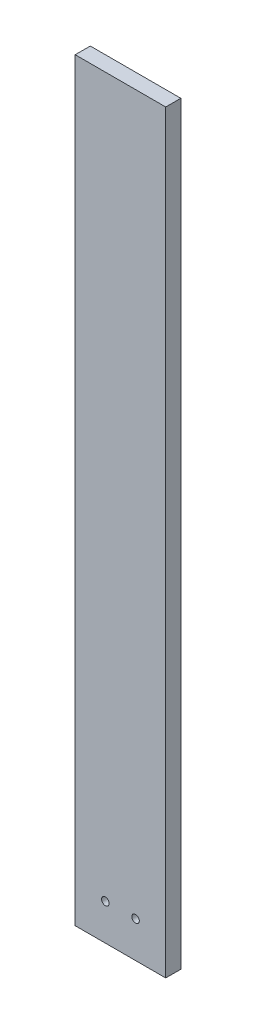
ISO-10303-21;
HEADER;
FILE_DESCRIPTION(('STEP AP214'),'2;1');
FILE_NAME('part.step','',(''),(''),'','','');
FILE_SCHEMA(('AUTOMOTIVE_DESIGN { 1 0 10303 214 1 1 1 1 }'));
ENDSEC;
DATA;
#1=APPLICATION_CONTEXT('core data for automotive mechanical design processes');
#2=APPLICATION_PROTOCOL_DEFINITION('international standard','automotive_design',2000,#1);
#3=PRODUCT_CONTEXT('',#1,'mechanical');
#4=PRODUCT('Part','Part','',(#3));
#5=PRODUCT_RELATED_PRODUCT_CATEGORY('part','',(#4));
#6=PRODUCT_DEFINITION_FORMATION('','',#4);
#7=PRODUCT_DEFINITION_CONTEXT('part definition',#1,'design');
#8=PRODUCT_DEFINITION('design','',#6,#7);
#9=PRODUCT_DEFINITION_SHAPE('','',#8);
#10=(LENGTH_UNIT() NAMED_UNIT(*) SI_UNIT(.MILLI.,.METRE.));
#11=(NAMED_UNIT(*) PLANE_ANGLE_UNIT() SI_UNIT($,.RADIAN.));
#12=(NAMED_UNIT(*) SI_UNIT($,.STERADIAN.) SOLID_ANGLE_UNIT());
#13=UNCERTAINTY_MEASURE_WITH_UNIT(LENGTH_MEASURE(1.E-05),#10,'distance_accuracy_value','');
#14=(GEOMETRIC_REPRESENTATION_CONTEXT(3) GLOBAL_UNCERTAINTY_ASSIGNED_CONTEXT((#13)) GLOBAL_UNIT_ASSIGNED_CONTEXT((#10,
#11,#12)) REPRESENTATION_CONTEXT('',''));
#15=CARTESIAN_POINT('',(0.,0.,0.));
#16=DIRECTION('',(0.,0.,1.));
#17=DIRECTION('',(1.,0.,0.));
#18=AXIS2_PLACEMENT_3D('',#15,#16,#17);
#19=CARTESIAN_POINT('',(30.,-250.,10.));
#20=DIRECTION('',(-1.,0.,0.));
#21=DIRECTION('',(0.,0.,1.));
#22=AXIS2_PLACEMENT_3D('',#19,#20,#21);
#23=PLANE('',#22);
#24=DIRECTION('',(0.,1.,0.));
#25=VECTOR('',#24,1.);
#26=CARTESIAN_POINT('',(30.,-250.,0.));
#27=LINE('',#26,#25);
#28=CARTESIAN_POINT('',(30.,-250.,0.));
#29=VERTEX_POINT('',#28);
#30=CARTESIAN_POINT('',(30.,250.,0.));
#31=VERTEX_POINT('',#30);
#32=EDGE_CURVE('E98',#29,#31,#27,.T.);
#33=ORIENTED_EDGE('',*,*,#32,.T.);
#34=DIRECTION('',(0.,0.,-1.));
#35=VECTOR('',#34,1.);
#36=CARTESIAN_POINT('',(30.,250.,10.));
#37=LINE('',#36,#35);
#38=CARTESIAN_POINT('',(30.,250.,10.));
#39=VERTEX_POINT('',#38);
#40=EDGE_CURVE('E11',#39,#31,#37,.T.);
#41=ORIENTED_EDGE('',*,*,#40,.F.);
#42=DIRECTION('',(0.,1.,0.));
#43=VECTOR('',#42,1.);
#44=CARTESIAN_POINT('',(30.,-250.,10.));
#45=LINE('',#44,#43);
#46=CARTESIAN_POINT('',(30.,-250.,10.));
#47=VERTEX_POINT('',#46);
#48=EDGE_CURVE('E86',#47,#39,#45,.T.);
#49=ORIENTED_EDGE('',*,*,#48,.F.);
#50=DIRECTION('',(0.,0.,-1.));
#51=VECTOR('',#50,1.);
#52=CARTESIAN_POINT('',(30.,-250.,10.));
#53=LINE('',#52,#51);
#54=EDGE_CURVE('E94',#47,#29,#53,.T.);
#55=ORIENTED_EDGE('',*,*,#54,.T.);
#56=EDGE_LOOP('',(#33,#41,#49,#55));
#57=FACE_BOUND('',#56,.T.);
#58=ADVANCED_FACE('F35',(#57),#23,.F.);
#59=CARTESIAN_POINT('',(-30.,250.,10.));
#60=DIRECTION('',(0.,-1.,0.));
#61=DIRECTION('',(0.,0.,-1.));
#62=AXIS2_PLACEMENT_3D('',#59,#60,#61);
#63=PLANE('',#62);
#64=DIRECTION('',(-1.,0.,0.));
#65=VECTOR('',#64,1.);
#66=CARTESIAN_POINT('',(-30.,250.,0.));
#67=LINE('',#66,#65);
#68=CARTESIAN_POINT('',(-30.,250.,0.));
#69=VERTEX_POINT('',#68);
#70=EDGE_CURVE('E90',#31,#69,#67,.T.);
#71=ORIENTED_EDGE('',*,*,#70,.T.);
#72=DIRECTION('',(0.,0.,-1.));
#73=VECTOR('',#72,1.);
#74=CARTESIAN_POINT('',(-30.,250.,10.));
#75=LINE('',#74,#73);
#76=CARTESIAN_POINT('',(-30.,250.,10.));
#77=VERTEX_POINT('',#76);
#78=EDGE_CURVE('E43',#77,#69,#75,.T.);
#79=ORIENTED_EDGE('',*,*,#78,.F.);
#80=DIRECTION('',(-1.,0.,0.));
#81=VECTOR('',#80,1.);
#82=CARTESIAN_POINT('',(-30.,250.,10.));
#83=LINE('',#82,#81);
#84=EDGE_CURVE('E81',#39,#77,#83,.T.);
#85=ORIENTED_EDGE('',*,*,#84,.F.);
#86=ORIENTED_EDGE('',*,*,#40,.T.);
#87=EDGE_LOOP('',(#71,#79,#85,#86));
#88=FACE_BOUND('',#87,.T.);
#89=ADVANCED_FACE('F89',(#88),#63,.F.);
#90=CARTESIAN_POINT('',(-30.,-250.,10.));
#91=DIRECTION('',(1.,0.,0.));
#92=DIRECTION('',(0.,0.,-1.));
#93=AXIS2_PLACEMENT_3D('',#90,#91,#92);
#94=PLANE('',#93);
#95=DIRECTION('',(0.,-1.,0.));
#96=VECTOR('',#95,1.);
#97=CARTESIAN_POINT('',(-30.,-250.,0.));
#98=LINE('',#97,#96);
#99=CARTESIAN_POINT('',(-30.,-250.,0.));
#100=VERTEX_POINT('',#99);
#101=EDGE_CURVE('E68',#69,#100,#98,.T.);
#102=ORIENTED_EDGE('',*,*,#101,.T.);
#103=DIRECTION('',(0.,0.,-1.));
#104=VECTOR('',#103,1.);
#105=CARTESIAN_POINT('',(-30.,-250.,10.));
#106=LINE('',#105,#104);
#107=CARTESIAN_POINT('',(-30.,-250.,10.));
#108=VERTEX_POINT('',#107);
#109=EDGE_CURVE('E91',#108,#100,#106,.T.);
#110=ORIENTED_EDGE('',*,*,#109,.F.);
#111=DIRECTION('',(0.,-1.,0.));
#112=VECTOR('',#111,1.);
#113=CARTESIAN_POINT('',(-30.,-250.,10.));
#114=LINE('',#113,#112);
#115=EDGE_CURVE('E84',#77,#108,#114,.T.);
#116=ORIENTED_EDGE('',*,*,#115,.F.);
#117=ORIENTED_EDGE('',*,*,#78,.T.);
#118=EDGE_LOOP('',(#102,#110,#116,#117));
#119=FACE_BOUND('',#118,.T.);
#120=ADVANCED_FACE('F92',(#119),#94,.F.);
#121=CARTESIAN_POINT('',(-30.,-250.,10.));
#122=DIRECTION('',(0.,1.,0.));
#123=DIRECTION('',(0.,0.,1.));
#124=AXIS2_PLACEMENT_3D('',#121,#122,#123);
#125=PLANE('',#124);
#126=DIRECTION('',(1.,0.,0.));
#127=VECTOR('',#126,1.);
#128=CARTESIAN_POINT('',(-30.,-250.,0.));
#129=LINE('',#128,#127);
#130=EDGE_CURVE('E74',#100,#29,#129,.T.);
#131=ORIENTED_EDGE('',*,*,#130,.T.);
#132=ORIENTED_EDGE('',*,*,#54,.F.);
#133=DIRECTION('',(1.,0.,0.));
#134=VECTOR('',#133,1.);
#135=CARTESIAN_POINT('',(-30.,-250.,10.));
#136=LINE('',#135,#134);
#137=EDGE_CURVE('E51',#108,#47,#136,.T.);
#138=ORIENTED_EDGE('',*,*,#137,.F.);
#139=ORIENTED_EDGE('',*,*,#109,.T.);
#140=EDGE_LOOP('',(#131,#132,#138,#139));
#141=FACE_BOUND('',#140,.T.);
#142=ADVANCED_FACE('F106',(#141),#125,.F.);
#143=CARTESIAN_POINT('',(0.,0.,10.));
#144=DIRECTION('',(0.,0.,-1.));
#145=DIRECTION('',(-1.,0.,0.));
#146=AXIS2_PLACEMENT_3D('',#143,#144,#145);
#147=PLANE('',#146);
#148=CARTESIAN_POINT('',(9.99999999999997,-226.,10.));
#149=DIRECTION('',(0.,0.,-1.));
#150=DIRECTION('',(1.,0.,0.));
#151=AXIS2_PLACEMENT_3D('',#148,#149,#150);
#152=CIRCLE('',#151,2.5);
#153=CARTESIAN_POINT('',(12.5,-226.,10.));
#154=VERTEX_POINT('',#153);
#155=EDGE_CURVE('E115',#154,#154,#152,.T.);
#156=ORIENTED_EDGE('',*,*,#155,.T.);
#157=EDGE_LOOP('',(#156));
#158=FACE_BOUND('',#157,.T.);
#159=CARTESIAN_POINT('',(-10.,-226.,10.));
#160=DIRECTION('',(0.,0.,-1.));
#161=DIRECTION('',(-1.,0.,0.));
#162=AXIS2_PLACEMENT_3D('',#159,#160,#161);
#163=CIRCLE('',#162,2.5);
#164=CARTESIAN_POINT('',(-12.5,-226.,10.));
#165=VERTEX_POINT('',#164);
#166=EDGE_CURVE('E101',#165,#165,#163,.T.);
#167=ORIENTED_EDGE('',*,*,#166,.T.);
#168=EDGE_LOOP('',(#167));
#169=FACE_BOUND('',#168,.T.);
#170=ORIENTED_EDGE('',*,*,#48,.T.);
#171=ORIENTED_EDGE('',*,*,#84,.T.);
#172=ORIENTED_EDGE('',*,*,#115,.T.);
#173=ORIENTED_EDGE('',*,*,#137,.T.);
#174=EDGE_LOOP('',(#170,#171,#172,#173));
#175=FACE_BOUND('',#174,.T.);
#176=ADVANCED_FACE('F82',(#158,#169,#175),#147,.F.);
#177=CARTESIAN_POINT('',(0.,0.,0.));
#178=DIRECTION('',(0.,0.,-1.));
#179=DIRECTION('',(-1.,0.,0.));
#180=AXIS2_PLACEMENT_3D('',#177,#178,#179);
#181=PLANE('',#180);
#182=CARTESIAN_POINT('',(9.99999999999997,-226.,0.));
#183=DIRECTION('',(0.,0.,-1.));
#184=DIRECTION('',(1.,0.,0.));
#185=AXIS2_PLACEMENT_3D('',#182,#183,#184);
#186=CIRCLE('',#185,2.5);
#187=CARTESIAN_POINT('',(12.5,-226.,0.));
#188=VERTEX_POINT('',#187);
#189=EDGE_CURVE('E118',#188,#188,#186,.T.);
#190=ORIENTED_EDGE('',*,*,#189,.F.);
#191=EDGE_LOOP('',(#190));
#192=FACE_BOUND('',#191,.T.);
#193=CARTESIAN_POINT('',(-10.,-226.,0.));
#194=DIRECTION('',(0.,0.,-1.));
#195=DIRECTION('',(-1.,0.,0.));
#196=AXIS2_PLACEMENT_3D('',#193,#194,#195);
#197=CIRCLE('',#196,2.5);
#198=CARTESIAN_POINT('',(-12.5,-226.,0.));
#199=VERTEX_POINT('',#198);
#200=EDGE_CURVE('E112',#199,#199,#197,.T.);
#201=ORIENTED_EDGE('',*,*,#200,.F.);
#202=EDGE_LOOP('',(#201));
#203=FACE_BOUND('',#202,.T.);
#204=ORIENTED_EDGE('',*,*,#32,.F.);
#205=ORIENTED_EDGE('',*,*,#130,.F.);
#206=ORIENTED_EDGE('',*,*,#101,.F.);
#207=ORIENTED_EDGE('',*,*,#70,.F.);
#208=EDGE_LOOP('',(#204,#205,#206,#207));
#209=FACE_BOUND('',#208,.T.);
#210=ADVANCED_FACE('F109',(#192,#203,#209),#181,.T.);
#211=CARTESIAN_POINT('',(-10.,-226.,10.));
#212=DIRECTION('',(0.,0.,-1.));
#213=DIRECTION('',(-1.,0.,0.));
#214=AXIS2_PLACEMENT_3D('',#211,#212,#213);
#215=CYLINDRICAL_SURFACE('',#214,2.5);
#216=ORIENTED_EDGE('',*,*,#166,.F.);
#217=EDGE_LOOP('',(#216));
#218=FACE_BOUND('',#217,.T.);
#219=ORIENTED_EDGE('',*,*,#200,.T.);
#220=EDGE_LOOP('',(#219));
#221=FACE_BOUND('',#220,.T.);
#222=ADVANCED_FACE('F129',(#218,#221),#215,.F.);
#223=CARTESIAN_POINT('',(9.99999999999997,-226.,10.));
#224=DIRECTION('',(0.,0.,-1.));
#225=DIRECTION('',(-1.,0.,0.));
#226=AXIS2_PLACEMENT_3D('',#223,#224,#225);
#227=CYLINDRICAL_SURFACE('',#226,2.5);
#228=ORIENTED_EDGE('',*,*,#155,.F.);
#229=EDGE_LOOP('',(#228));
#230=FACE_BOUND('',#229,.T.);
#231=ORIENTED_EDGE('',*,*,#189,.T.);
#232=EDGE_LOOP('',(#231));
#233=FACE_BOUND('',#232,.T.);
#234=ADVANCED_FACE('F126',(#230,#233),#227,.F.);
#235=CLOSED_SHELL('',(#58,#89,#120,#142,#176,#210,#222,#234));
#236=MANIFOLD_SOLID_BREP('B2',#235);
#237=ADVANCED_BREP_SHAPE_REPRESENTATION('',(#18,#236),#14);
#238=SHAPE_DEFINITION_REPRESENTATION(#9,#237);
ENDSEC;
END-ISO-10303-21;
